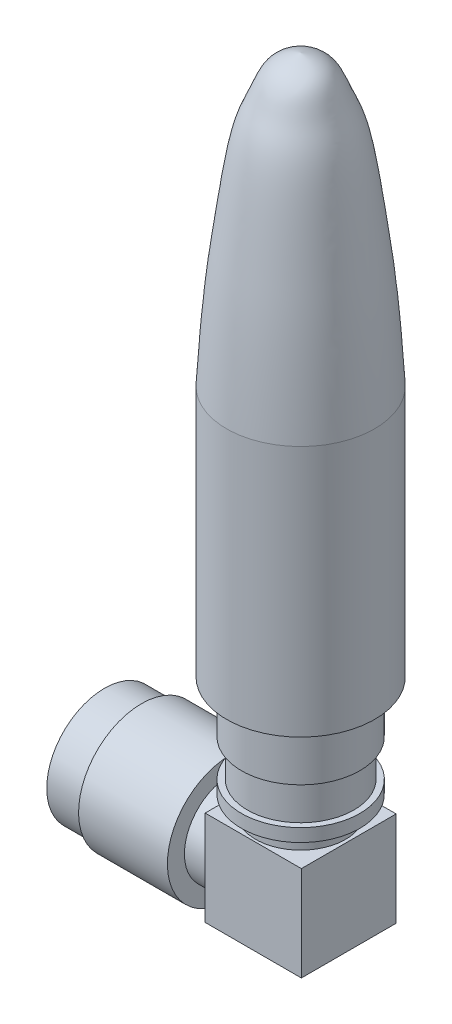
ISO-10303-21;
HEADER;
FILE_DESCRIPTION(('STEP AP214'),'2;1');
FILE_NAME('part.step','',(''),(''),'','','');
FILE_SCHEMA(('AUTOMOTIVE_DESIGN { 1 0 10303 214 1 1 1 1 }'));
ENDSEC;
DATA;
#1=APPLICATION_CONTEXT('core data for automotive mechanical design processes');
#2=APPLICATION_PROTOCOL_DEFINITION('international standard','automotive_design',2000,#1);
#3=PRODUCT_CONTEXT('',#1,'mechanical');
#4=PRODUCT('Part','Part','',(#3));
#5=PRODUCT_RELATED_PRODUCT_CATEGORY('part','',(#4));
#6=PRODUCT_DEFINITION_FORMATION('','',#4);
#7=PRODUCT_DEFINITION_CONTEXT('part definition',#1,'design');
#8=PRODUCT_DEFINITION('design','',#6,#7);
#9=PRODUCT_DEFINITION_SHAPE('','',#8);
#10=(LENGTH_UNIT() NAMED_UNIT(*) SI_UNIT(.MILLI.,.METRE.));
#11=(NAMED_UNIT(*) PLANE_ANGLE_UNIT() SI_UNIT($,.RADIAN.));
#12=(NAMED_UNIT(*) SI_UNIT($,.STERADIAN.) SOLID_ANGLE_UNIT());
#13=UNCERTAINTY_MEASURE_WITH_UNIT(LENGTH_MEASURE(1.E-05),#10,'distance_accuracy_value','');
#14=(GEOMETRIC_REPRESENTATION_CONTEXT(3) GLOBAL_UNCERTAINTY_ASSIGNED_CONTEXT((#13)) GLOBAL_UNIT_ASSIGNED_CONTEXT((#10,
#11,#12)) REPRESENTATION_CONTEXT('',''));
#15=CARTESIAN_POINT('',(0.,0.,0.));
#16=DIRECTION('',(0.,0.,1.));
#17=DIRECTION('',(1.,0.,0.));
#18=AXIS2_PLACEMENT_3D('',#15,#16,#17);
#19=CARTESIAN_POINT('',(0.,44.5,0.));
#20=CARTESIAN_POINT('',(-1.89606189247461,44.0308086483441,0.));
#21=CARTESIAN_POINT('',(-1.97701979249376,43.1402962804108,0.));
#22=CARTESIAN_POINT('',(-3.37077611296164,40.0754867193968,0.));
#23=CARTESIAN_POINT('',(-3.77478050947354,37.4069595656387,0.));
#24=CARTESIAN_POINT('',(-4.72216637205014,30.033496438992,0.));
#25=CARTESIAN_POINT('',(-5.,25.,0.));
#26=B_SPLINE_CURVE_WITH_KNOTS('',3,(#19,#20,#21,#22,#23,#24,#25),.UNSPECIFIED.,.F.,.F.,(4,1,1,1,
4),(0.,0.430511616125023,0.521637502180353,0.867967598511861,1.),.UNSPECIFIED.);
#27=CARTESIAN_POINT('',(0.,-22.6950680606462,0.));
#28=DIRECTION('',(0.,-1.,0.));
#29=AXIS1_PLACEMENT('',#27,#28);
#30=SURFACE_OF_REVOLUTION('',#26,#29);
#31=CARTESIAN_POINT('',(0.,25.,0.));
#32=DIRECTION('',(0.,-1.,0.));
#33=DIRECTION('',(0.,0.,-1.));
#34=AXIS2_PLACEMENT_3D('',#31,#32,#33);
#35=CIRCLE('',#34,5.);
#36=CARTESIAN_POINT('',(0.,25.,-5.));
#37=VERTEX_POINT('',#36);
#38=EDGE_CURVE('E11',#37,#37,#35,.T.);
#39=ORIENTED_EDGE('',*,*,#38,.F.);
#40=EDGE_LOOP('',(#39));
#41=FACE_BOUND('',#40,.T.);
#42=CARTESIAN_POINT('',(0.,44.5,0.));
#43=VERTEX_POINT('',#42);
#44=VERTEX_LOOP('',#43);
#45=FACE_BOUND('',#44,.T.);
#46=ADVANCED_FACE('F34',(#41,#45),#30,.T.);
#47=CARTESIAN_POINT('',(0.,-22.6950680606462,0.));
#48=DIRECTION('',(0.,-1.,0.));
#49=DIRECTION('',(0.,0.,-1.));
#50=AXIS2_PLACEMENT_3D('',#47,#48,#49);
#51=CYLINDRICAL_SURFACE('',#50,5.);
#52=CARTESIAN_POINT('',(0.,8.,0.));
#53=DIRECTION('',(0.,-1.,0.));
#54=DIRECTION('',(0.,0.,-1.));
#55=AXIS2_PLACEMENT_3D('',#52,#53,#54);
#56=CIRCLE('',#55,5.);
#57=CARTESIAN_POINT('',(0.,8.,-5.));
#58=VERTEX_POINT('',#57);
#59=EDGE_CURVE('E42',#58,#58,#56,.T.);
#60=ORIENTED_EDGE('',*,*,#59,.F.);
#61=EDGE_LOOP('',(#60));
#62=FACE_BOUND('',#61,.T.);
#63=ORIENTED_EDGE('',*,*,#38,.T.);
#64=EDGE_LOOP('',(#63));
#65=FACE_BOUND('',#64,.T.);
#66=ADVANCED_FACE('F150',(#62,#65),#51,.T.);
#67=CARTESIAN_POINT('',(-4.,8.,0.));
#68=DIRECTION('',(0.,1.,0.));
#69=DIRECTION('',(0.,0.,1.));
#70=AXIS2_PLACEMENT_3D('',#67,#68,#69);
#71=PLANE('',#70);
#72=CARTESIAN_POINT('',(0.,8.,0.));
#73=DIRECTION('',(0.,-1.,0.));
#74=DIRECTION('',(0.,0.,-1.));
#75=AXIS2_PLACEMENT_3D('',#72,#73,#74);
#76=CIRCLE('',#75,4.);
#77=CARTESIAN_POINT('',(0.,8.,-4.));
#78=VERTEX_POINT('',#77);
#79=EDGE_CURVE('E143',#78,#78,#76,.T.);
#80=ORIENTED_EDGE('',*,*,#79,.F.);
#81=EDGE_LOOP('',(#80));
#82=FACE_BOUND('',#81,.T.);
#83=ORIENTED_EDGE('',*,*,#59,.T.);
#84=EDGE_LOOP('',(#83));
#85=FACE_BOUND('',#84,.T.);
#86=ADVANCED_FACE('F148',(#82,#85),#71,.F.);
#87=CARTESIAN_POINT('',(0.,-22.6950680606462,0.));
#88=DIRECTION('',(0.,-1.,0.));
#89=DIRECTION('',(0.,0.,-1.));
#90=AXIS2_PLACEMENT_3D('',#87,#88,#89);
#91=CYLINDRICAL_SURFACE('',#90,4.);
#92=CARTESIAN_POINT('',(0.,4.5,0.));
#93=DIRECTION('',(0.,-1.,0.));
#94=DIRECTION('',(0.,0.,-1.));
#95=AXIS2_PLACEMENT_3D('',#92,#93,#94);
#96=CIRCLE('',#95,4.);
#97=CARTESIAN_POINT('',(0.,4.5,-4.));
#98=VERTEX_POINT('',#97);
#99=EDGE_CURVE('E140',#98,#98,#96,.T.);
#100=ORIENTED_EDGE('',*,*,#99,.F.);
#101=EDGE_LOOP('',(#100));
#102=FACE_BOUND('',#101,.T.);
#103=ORIENTED_EDGE('',*,*,#79,.T.);
#104=EDGE_LOOP('',(#103));
#105=FACE_BOUND('',#104,.T.);
#106=ADVANCED_FACE('F168',(#102,#105),#91,.T.);
#107=CARTESIAN_POINT('',(-3.6,4.5,0.));
#108=DIRECTION('',(0.,1.,0.));
#109=DIRECTION('',(0.,0.,1.));
#110=AXIS2_PLACEMENT_3D('',#107,#108,#109);
#111=PLANE('',#110);
#112=CARTESIAN_POINT('',(0.,4.5,0.));
#113=DIRECTION('',(0.,-1.,0.));
#114=DIRECTION('',(0.,0.,-1.));
#115=AXIS2_PLACEMENT_3D('',#112,#113,#114);
#116=CIRCLE('',#115,3.6);
#117=CARTESIAN_POINT('',(0.,4.5,-3.6));
#118=VERTEX_POINT('',#117);
#119=EDGE_CURVE('E137',#118,#118,#116,.T.);
#120=ORIENTED_EDGE('',*,*,#119,.F.);
#121=EDGE_LOOP('',(#120));
#122=FACE_BOUND('',#121,.T.);
#123=ORIENTED_EDGE('',*,*,#99,.T.);
#124=EDGE_LOOP('',(#123));
#125=FACE_BOUND('',#124,.T.);
#126=ADVANCED_FACE('F176',(#122,#125),#111,.F.);
#127=CARTESIAN_POINT('',(0.,-22.6950680606462,0.));
#128=DIRECTION('',(0.,-1.,0.));
#129=DIRECTION('',(0.,0.,-1.));
#130=AXIS2_PLACEMENT_3D('',#127,#128,#129);
#131=CYLINDRICAL_SURFACE('',#130,3.6);
#132=CARTESIAN_POINT('',(0.,2.,0.));
#133=DIRECTION('',(0.,-1.,0.));
#134=DIRECTION('',(0.,0.,-1.));
#135=AXIS2_PLACEMENT_3D('',#132,#133,#134);
#136=CIRCLE('',#135,3.6);
#137=CARTESIAN_POINT('',(0.,2.,-3.6));
#138=VERTEX_POINT('',#137);
#139=EDGE_CURVE('E134',#138,#138,#136,.T.);
#140=ORIENTED_EDGE('',*,*,#139,.F.);
#141=EDGE_LOOP('',(#140));
#142=FACE_BOUND('',#141,.T.);
#143=ORIENTED_EDGE('',*,*,#119,.T.);
#144=EDGE_LOOP('',(#143));
#145=FACE_BOUND('',#144,.T.);
#146=ADVANCED_FACE('F184',(#142,#145),#131,.T.);
#147=CARTESIAN_POINT('',(-4.,2.,0.));
#148=DIRECTION('',(0.,-1.,0.));
#149=DIRECTION('',(0.,0.,-1.));
#150=AXIS2_PLACEMENT_3D('',#147,#148,#149);
#151=PLANE('',#150);
#152=CARTESIAN_POINT('',(0.,2.,0.));
#153=DIRECTION('',(0.,-1.,0.));
#154=DIRECTION('',(0.,0.,-1.));
#155=AXIS2_PLACEMENT_3D('',#152,#153,#154);
#156=CIRCLE('',#155,4.);
#157=CARTESIAN_POINT('',(0.,2.,-4.));
#158=VERTEX_POINT('',#157);
#159=EDGE_CURVE('E131',#158,#158,#156,.T.);
#160=ORIENTED_EDGE('',*,*,#159,.F.);
#161=EDGE_LOOP('',(#160));
#162=FACE_BOUND('',#161,.T.);
#163=ORIENTED_EDGE('',*,*,#139,.T.);
#164=EDGE_LOOP('',(#163));
#165=FACE_BOUND('',#164,.T.);
#166=ADVANCED_FACE('F192',(#162,#165),#151,.F.);
#167=CARTESIAN_POINT('',(0.,-22.6950680606462,0.));
#168=DIRECTION('',(0.,-1.,0.));
#169=DIRECTION('',(0.,0.,-1.));
#170=AXIS2_PLACEMENT_3D('',#167,#168,#169);
#171=CYLINDRICAL_SURFACE('',#170,4.);
#172=CARTESIAN_POINT('',(0.,1.12572041639324,0.));
#173=DIRECTION('',(0.,-1.,0.));
#174=DIRECTION('',(0.,0.,-1.));
#175=AXIS2_PLACEMENT_3D('',#172,#173,#174);
#176=CIRCLE('',#175,4.);
#177=CARTESIAN_POINT('',(0.,1.12572041639324,-4.));
#178=VERTEX_POINT('',#177);
#179=EDGE_CURVE('E128',#178,#178,#176,.T.);
#180=ORIENTED_EDGE('',*,*,#179,.F.);
#181=EDGE_LOOP('',(#180));
#182=FACE_BOUND('',#181,.T.);
#183=ORIENTED_EDGE('',*,*,#159,.T.);
#184=EDGE_LOOP('',(#183));
#185=FACE_BOUND('',#184,.T.);
#186=ADVANCED_FACE('F200',(#182,#185),#171,.T.);
#187=CARTESIAN_POINT('',(-3.03667061907664,1.12572041639323,0.));
#188=DIRECTION('',(0.,1.,0.));
#189=DIRECTION('',(0.,0.,1.));
#190=AXIS2_PLACEMENT_3D('',#187,#188,#189);
#191=PLANE('',#190);
#192=CARTESIAN_POINT('',(0.,1.12572041639324,0.));
#193=DIRECTION('',(0.,-1.,0.));
#194=DIRECTION('',(0.,0.,-1.));
#195=AXIS2_PLACEMENT_3D('',#192,#193,#194);
#196=CIRCLE('',#195,3.03667061907664);
#197=CARTESIAN_POINT('',(0.,1.12572041639324,-3.03667061907664));
#198=VERTEX_POINT('',#197);
#199=EDGE_CURVE('E125',#198,#198,#196,.T.);
#200=ORIENTED_EDGE('',*,*,#199,.F.);
#201=EDGE_LOOP('',(#200));
#202=FACE_BOUND('',#201,.T.);
#203=ORIENTED_EDGE('',*,*,#179,.T.);
#204=EDGE_LOOP('',(#203));
#205=FACE_BOUND('',#204,.T.);
#206=ADVANCED_FACE('F208',(#202,#205),#191,.F.);
#207=CARTESIAN_POINT('',(0.,-22.6950680606462,0.));
#208=DIRECTION('',(0.,-1.,0.));
#209=DIRECTION('',(0.,0.,-1.));
#210=AXIS2_PLACEMENT_3D('',#207,#208,#209);
#211=CYLINDRICAL_SURFACE('',#210,3.03667061907664);
#212=CARTESIAN_POINT('',(0.,0.,0.));
#213=DIRECTION('',(0.,-1.,0.));
#214=DIRECTION('',(0.,0.,-1.));
#215=AXIS2_PLACEMENT_3D('',#212,#213,#214);
#216=CIRCLE('',#215,3.03667061907664);
#217=CARTESIAN_POINT('',(0.,0.,-3.03667061907664));
#218=VERTEX_POINT('',#217);
#219=EDGE_CURVE('E115',#218,#218,#216,.T.);
#220=ORIENTED_EDGE('',*,*,#219,.F.);
#221=EDGE_LOOP('',(#220));
#222=FACE_BOUND('',#221,.T.);
#223=ORIENTED_EDGE('',*,*,#199,.T.);
#224=EDGE_LOOP('',(#223));
#225=FACE_BOUND('',#224,.T.);
#226=ADVANCED_FACE('F216',(#222,#225),#211,.T.);
#227=CARTESIAN_POINT('',(0.,0.,0.));
#228=DIRECTION('',(0.,-1.,0.));
#229=DIRECTION('',(0.,0.,-1.));
#230=AXIS2_PLACEMENT_3D('',#227,#228,#229);
#231=PLANE('',#230);
#232=DIRECTION('',(0.,0.,-1.));
#233=VECTOR('',#232,1.);
#234=CARTESIAN_POINT('',(-3.25,0.,3.2));
#235=LINE('',#234,#233);
#236=CARTESIAN_POINT('',(-3.25,0.,3.2));
#237=VERTEX_POINT('',#236);
#238=CARTESIAN_POINT('',(-3.25,0.,-3.2));
#239=VERTEX_POINT('',#238);
#240=EDGE_CURVE('E105',#237,#239,#235,.T.);
#241=ORIENTED_EDGE('',*,*,#240,.F.);
#242=DIRECTION('',(-1.,0.,0.));
#243=VECTOR('',#242,1.);
#244=CARTESIAN_POINT('',(-3.25,0.,3.2));
#245=LINE('',#244,#243);
#246=CARTESIAN_POINT('',(3.25,0.,3.2));
#247=VERTEX_POINT('',#246);
#248=EDGE_CURVE('E73',#247,#237,#245,.T.);
#249=ORIENTED_EDGE('',*,*,#248,.F.);
#250=DIRECTION('',(0.,0.,1.));
#251=VECTOR('',#250,1.);
#252=CARTESIAN_POINT('',(3.25,0.,3.2));
#253=LINE('',#252,#251);
#254=CARTESIAN_POINT('',(3.25,0.,-3.2));
#255=VERTEX_POINT('',#254);
#256=EDGE_CURVE('E110',#255,#247,#253,.T.);
#257=ORIENTED_EDGE('',*,*,#256,.F.);
#258=DIRECTION('',(1.,0.,0.));
#259=VECTOR('',#258,1.);
#260=CARTESIAN_POINT('',(-3.25,0.,-3.2));
#261=LINE('',#260,#259);
#262=EDGE_CURVE('E93',#239,#255,#261,.T.);
#263=ORIENTED_EDGE('',*,*,#262,.F.);
#264=EDGE_LOOP('',(#241,#249,#257,#263));
#265=FACE_BOUND('',#264,.T.);
#266=ORIENTED_EDGE('',*,*,#219,.T.);
#267=EDGE_LOOP('',(#266));
#268=FACE_BOUND('',#267,.T.);
#269=ADVANCED_FACE('F224',(#265,#268),#231,.F.);
#270=CARTESIAN_POINT('',(-3.25,-6.4,3.2));
#271=DIRECTION('',(1.,0.,0.));
#272=DIRECTION('',(0.,0.,-1.));
#273=AXIS2_PLACEMENT_3D('',#270,#271,#272);
#274=PLANE('',#273);
#275=CARTESIAN_POINT('',(-3.25,-3.2,0.));
#276=DIRECTION('',(1.,0.,0.));
#277=DIRECTION('',(0.,1.,0.));
#278=AXIS2_PLACEMENT_3D('',#275,#276,#277);
#279=CIRCLE('',#278,3.1);
#280=CARTESIAN_POINT('',(-3.25,-0.100000000000001,0.));
#281=VERTEX_POINT('',#280);
#282=EDGE_CURVE('E108',#281,#281,#279,.T.);
#283=ORIENTED_EDGE('',*,*,#282,.T.);
#284=EDGE_LOOP('',(#283));
#285=FACE_BOUND('',#284,.T.);
#286=ORIENTED_EDGE('',*,*,#240,.T.);
#287=DIRECTION('',(0.,1.,0.));
#288=VECTOR('',#287,1.);
#289=CARTESIAN_POINT('',(-3.25,-6.4,-3.2));
#290=LINE('',#289,#288);
#291=CARTESIAN_POINT('',(-3.25,-6.4,-3.2));
#292=VERTEX_POINT('',#291);
#293=EDGE_CURVE('E96',#292,#239,#290,.T.);
#294=ORIENTED_EDGE('',*,*,#293,.F.);
#295=DIRECTION('',(0.,0.,-1.));
#296=VECTOR('',#295,1.);
#297=CARTESIAN_POINT('',(-3.25,-6.4,3.2));
#298=LINE('',#297,#296);
#299=CARTESIAN_POINT('',(-3.25,-6.4,3.2));
#300=VERTEX_POINT('',#299);
#301=EDGE_CURVE('E87',#300,#292,#298,.T.);
#302=ORIENTED_EDGE('',*,*,#301,.F.);
#303=DIRECTION('',(0.,1.,0.));
#304=VECTOR('',#303,1.);
#305=CARTESIAN_POINT('',(-3.25,-6.4,3.2));
#306=LINE('',#305,#304);
#307=EDGE_CURVE('E101',#300,#237,#306,.T.);
#308=ORIENTED_EDGE('',*,*,#307,.T.);
#309=EDGE_LOOP('',(#286,#294,#302,#308));
#310=FACE_BOUND('',#309,.T.);
#311=ADVANCED_FACE('F232',(#285,#310),#274,.F.);
#312=CARTESIAN_POINT('',(-3.25,-6.4,-3.2));
#313=DIRECTION('',(0.,0.,1.));
#314=DIRECTION('',(1.,0.,0.));
#315=AXIS2_PLACEMENT_3D('',#312,#313,#314);
#316=PLANE('',#315);
#317=ORIENTED_EDGE('',*,*,#262,.T.);
#318=DIRECTION('',(0.,1.,0.));
#319=VECTOR('',#318,1.);
#320=CARTESIAN_POINT('',(3.25,-6.4,-3.2));
#321=LINE('',#320,#319);
#322=CARTESIAN_POINT('',(3.25,-6.4,-3.2));
#323=VERTEX_POINT('',#322);
#324=EDGE_CURVE('E91',#323,#255,#321,.T.);
#325=ORIENTED_EDGE('',*,*,#324,.F.);
#326=DIRECTION('',(1.,0.,0.));
#327=VECTOR('',#326,1.);
#328=CARTESIAN_POINT('',(-3.25,-6.4,-3.2));
#329=LINE('',#328,#327);
#330=EDGE_CURVE('E81',#292,#323,#329,.T.);
#331=ORIENTED_EDGE('',*,*,#330,.F.);
#332=ORIENTED_EDGE('',*,*,#293,.T.);
#333=EDGE_LOOP('',(#317,#325,#331,#332));
#334=FACE_BOUND('',#333,.T.);
#335=ADVANCED_FACE('F92',(#334),#316,.F.);
#336=CARTESIAN_POINT('',(3.25,-6.4,3.2));
#337=DIRECTION('',(-1.,0.,0.));
#338=DIRECTION('',(0.,0.,1.));
#339=AXIS2_PLACEMENT_3D('',#336,#337,#338);
#340=PLANE('',#339);
#341=ORIENTED_EDGE('',*,*,#256,.T.);
#342=DIRECTION('',(0.,1.,0.));
#343=VECTOR('',#342,1.);
#344=CARTESIAN_POINT('',(3.25,-6.4,3.2));
#345=LINE('',#344,#343);
#346=CARTESIAN_POINT('',(3.25,-6.4,3.2));
#347=VERTEX_POINT('',#346);
#348=EDGE_CURVE('E97',#347,#247,#345,.T.);
#349=ORIENTED_EDGE('',*,*,#348,.F.);
#350=DIRECTION('',(0.,0.,1.));
#351=VECTOR('',#350,1.);
#352=CARTESIAN_POINT('',(3.25,-6.4,3.2));
#353=LINE('',#352,#351);
#354=EDGE_CURVE('E84',#323,#347,#353,.T.);
#355=ORIENTED_EDGE('',*,*,#354,.F.);
#356=ORIENTED_EDGE('',*,*,#324,.T.);
#357=EDGE_LOOP('',(#341,#349,#355,#356));
#358=FACE_BOUND('',#357,.T.);
#359=ADVANCED_FACE('F99',(#358),#340,.F.);
#360=CARTESIAN_POINT('',(-3.25,-6.4,3.2));
#361=DIRECTION('',(0.,0.,-1.));
#362=DIRECTION('',(-1.,0.,0.));
#363=AXIS2_PLACEMENT_3D('',#360,#361,#362);
#364=PLANE('',#363);
#365=ORIENTED_EDGE('',*,*,#248,.T.);
#366=ORIENTED_EDGE('',*,*,#307,.F.);
#367=DIRECTION('',(-1.,0.,0.));
#368=VECTOR('',#367,1.);
#369=CARTESIAN_POINT('',(-3.25,-6.4,3.2));
#370=LINE('',#369,#368);
#371=EDGE_CURVE('E53',#347,#300,#370,.T.);
#372=ORIENTED_EDGE('',*,*,#371,.F.);
#373=ORIENTED_EDGE('',*,*,#348,.T.);
#374=EDGE_LOOP('',(#365,#366,#372,#373));
#375=FACE_BOUND('',#374,.T.);
#376=ADVANCED_FACE('F255',(#375),#364,.F.);
#377=CARTESIAN_POINT('',(0.,-6.4,0.));
#378=DIRECTION('',(0.,-1.,0.));
#379=DIRECTION('',(0.,0.,-1.));
#380=AXIS2_PLACEMENT_3D('',#377,#378,#379);
#381=PLANE('',#380);
#382=ORIENTED_EDGE('',*,*,#301,.T.);
#383=ORIENTED_EDGE('',*,*,#330,.T.);
#384=ORIENTED_EDGE('',*,*,#354,.T.);
#385=ORIENTED_EDGE('',*,*,#371,.T.);
#386=EDGE_LOOP('',(#382,#383,#384,#385));
#387=FACE_BOUND('',#386,.T.);
#388=ADVANCED_FACE('F82',(#387),#381,.T.);
#389=CARTESIAN_POINT('',(-3.25,-3.2,0.));
#390=DIRECTION('',(1.,0.,0.));
#391=DIRECTION('',(0.,1.,0.));
#392=AXIS2_PLACEMENT_3D('',#389,#390,#391);
#393=CYLINDRICAL_SURFACE('',#392,3.1);
#394=CARTESIAN_POINT('',(-4.75,-3.2,0.));
#395=DIRECTION('',(1.,0.,0.));
#396=DIRECTION('',(0.,1.,0.));
#397=AXIS2_PLACEMENT_3D('',#394,#395,#396);
#398=CIRCLE('',#397,3.1);
#399=CARTESIAN_POINT('',(-4.75,-0.100000000000001,0.));
#400=VERTEX_POINT('',#399);
#401=EDGE_CURVE('E400',#400,#400,#398,.T.);
#402=ORIENTED_EDGE('',*,*,#401,.T.);
#403=EDGE_LOOP('',(#402));
#404=FACE_BOUND('',#403,.T.);
#405=ORIENTED_EDGE('',*,*,#282,.F.);
#406=EDGE_LOOP('',(#405));
#407=FACE_BOUND('',#406,.T.);
#408=ADVANCED_FACE('F267',(#404,#407),#393,.T.);
#409=CARTESIAN_POINT('',(-4.75,-0.100000000000001,0.));
#410=DIRECTION('',(1.,0.,0.));
#411=DIRECTION('',(0.,1.,0.));
#412=AXIS2_PLACEMENT_3D('',#409,#410,#411);
#413=PLANE('',#412);
#414=CARTESIAN_POINT('',(-4.75,-3.2,0.));
#415=DIRECTION('',(1.,0.,0.));
#416=DIRECTION('',(0.,1.,0.));
#417=AXIS2_PLACEMENT_3D('',#414,#415,#416);
#418=CIRCLE('',#417,4.25);
#419=CARTESIAN_POINT('',(-4.75,1.05,0.));
#420=VERTEX_POINT('',#419);
#421=EDGE_CURVE('E397',#420,#420,#418,.T.);
#422=ORIENTED_EDGE('',*,*,#421,.T.);
#423=EDGE_LOOP('',(#422));
#424=FACE_BOUND('',#423,.T.);
#425=ORIENTED_EDGE('',*,*,#401,.F.);
#426=EDGE_LOOP('',(#425));
#427=FACE_BOUND('',#426,.T.);
#428=ADVANCED_FACE('F273',(#424,#427),#413,.T.);
#429=CARTESIAN_POINT('',(-3.25,-3.2,0.));
#430=DIRECTION('',(1.,0.,0.));
#431=DIRECTION('',(0.,1.,0.));
#432=AXIS2_PLACEMENT_3D('',#429,#430,#431);
#433=CYLINDRICAL_SURFACE('',#432,4.25);
#434=CARTESIAN_POINT('',(-10.75,-3.2,0.));
#435=DIRECTION('',(1.,0.,0.));
#436=DIRECTION('',(0.,1.,0.));
#437=AXIS2_PLACEMENT_3D('',#434,#435,#436);
#438=CIRCLE('',#437,4.25);
#439=CARTESIAN_POINT('',(-10.75,1.05,0.));
#440=VERTEX_POINT('',#439);
#441=EDGE_CURVE('E394',#440,#440,#438,.T.);
#442=ORIENTED_EDGE('',*,*,#441,.T.);
#443=EDGE_LOOP('',(#442));
#444=FACE_BOUND('',#443,.T.);
#445=ORIENTED_EDGE('',*,*,#421,.F.);
#446=EDGE_LOOP('',(#445));
#447=FACE_BOUND('',#446,.T.);
#448=ADVANCED_FACE('F281',(#444,#447),#433,.T.);
#449=CARTESIAN_POINT('',(-10.75,1.05,0.));
#450=DIRECTION('',(-1.,0.,0.));
#451=DIRECTION('',(0.,-1.,0.));
#452=AXIS2_PLACEMENT_3D('',#449,#450,#451);
#453=PLANE('',#452);
#454=CARTESIAN_POINT('',(-10.75,-3.2,0.));
#455=DIRECTION('',(1.,0.,0.));
#456=DIRECTION('',(0.,1.,0.));
#457=AXIS2_PLACEMENT_3D('',#454,#455,#456);
#458=CIRCLE('',#457,3.9);
#459=CARTESIAN_POINT('',(-10.75,0.699999999999998,0.));
#460=VERTEX_POINT('',#459);
#461=EDGE_CURVE('E387',#460,#460,#458,.T.);
#462=ORIENTED_EDGE('',*,*,#461,.T.);
#463=EDGE_LOOP('',(#462));
#464=FACE_BOUND('',#463,.T.);
#465=ORIENTED_EDGE('',*,*,#441,.F.);
#466=EDGE_LOOP('',(#465));
#467=FACE_BOUND('',#466,.T.);
#468=ADVANCED_FACE('F289',(#464,#467),#453,.T.);
#469=CARTESIAN_POINT('',(-3.25,-3.2,0.));
#470=DIRECTION('',(1.,0.,0.));
#471=DIRECTION('',(0.,1.,0.));
#472=AXIS2_PLACEMENT_3D('',#469,#470,#471);
#473=CYLINDRICAL_SURFACE('',#472,3.9);
#474=CARTESIAN_POINT('',(-13.25,-3.2,0.));
#475=DIRECTION('',(1.,0.,0.));
#476=DIRECTION('',(0.,1.,0.));
#477=AXIS2_PLACEMENT_3D('',#474,#475,#476);
#478=CIRCLE('',#477,3.9);
#479=CARTESIAN_POINT('',(-13.25,0.699999999999998,0.));
#480=VERTEX_POINT('',#479);
#481=EDGE_CURVE('E383',#480,#480,#478,.T.);
#482=ORIENTED_EDGE('',*,*,#481,.T.);
#483=EDGE_LOOP('',(#482));
#484=FACE_BOUND('',#483,.T.);
#485=ORIENTED_EDGE('',*,*,#461,.F.);
#486=EDGE_LOOP('',(#485));
#487=FACE_BOUND('',#486,.T.);
#488=ADVANCED_FACE('F297',(#484,#487),#473,.T.);
#489=CARTESIAN_POINT('',(-13.25,0.699999999999998,0.));
#490=DIRECTION('',(-1.,0.,0.));
#491=DIRECTION('',(0.,-1.,0.));
#492=AXIS2_PLACEMENT_3D('',#489,#490,#491);
#493=PLANE('',#492);
#494=CARTESIAN_POINT('',(-13.25,-3.2,0.));
#495=DIRECTION('',(-1.,0.,0.));
#496=DIRECTION('',(0.,-1.,0.));
#497=AXIS2_PLACEMENT_3D('',#494,#495,#496);
#498=CIRCLE('',#497,2.7);
#499=CARTESIAN_POINT('',(-13.25,-5.9,0.));
#500=VERTEX_POINT('',#499);
#501=EDGE_CURVE('E384',#500,#500,#498,.T.);
#502=ORIENTED_EDGE('',*,*,#501,.F.);
#503=EDGE_LOOP('',(#502));
#504=FACE_BOUND('',#503,.T.);
#505=ORIENTED_EDGE('',*,*,#481,.F.);
#506=EDGE_LOOP('',(#505));
#507=FACE_BOUND('',#506,.T.);
#508=ADVANCED_FACE('F305',(#504,#507),#493,.T.);
#509=CARTESIAN_POINT('',(-8.25,-3.2,0.));
#510=DIRECTION('',(-1.,0.,0.));
#511=DIRECTION('',(0.,-1.,0.));
#512=AXIS2_PLACEMENT_3D('',#509,#510,#511);
#513=CYLINDRICAL_SURFACE('',#512,2.7);
#514=CARTESIAN_POINT('',(-8.25,-3.2,0.));
#515=DIRECTION('',(-1.,0.,0.));
#516=DIRECTION('',(0.,-1.,0.));
#517=AXIS2_PLACEMENT_3D('',#514,#515,#516);
#518=CIRCLE('',#517,2.7);
#519=CARTESIAN_POINT('',(-8.25,-5.9,0.));
#520=VERTEX_POINT('',#519);
#521=EDGE_CURVE('E382',#520,#520,#518,.T.);
#522=ORIENTED_EDGE('',*,*,#521,.F.);
#523=EDGE_LOOP('',(#522));
#524=FACE_BOUND('',#523,.T.);
#525=ORIENTED_EDGE('',*,*,#501,.T.);
#526=EDGE_LOOP('',(#525));
#527=FACE_BOUND('',#526,.T.);
#528=ADVANCED_FACE('F313',(#524,#527),#513,.F.);
#529=CARTESIAN_POINT('',(-8.25,-3.2,0.));
#530=DIRECTION('',(-1.,0.,0.));
#531=DIRECTION('',(0.,-1.,0.));
#532=AXIS2_PLACEMENT_3D('',#529,#530,#531);
#533=PLANE('',#532);
#534=ORIENTED_EDGE('',*,*,#521,.T.);
#535=EDGE_LOOP('',(#534));
#536=FACE_BOUND('',#535,.T.);
#537=ADVANCED_FACE('F321',(#536),#533,.T.);
#538=CLOSED_SHELL('',(#46,#66,#86,#106,#126,#146,#166,#186,#206,#226,#269,#311,#335,#359,#376,
#388,#408,#428,#448,#468,#488,#508,#528,#537));
#539=MANIFOLD_SOLID_BREP('B2',#538);
#540=ADVANCED_BREP_SHAPE_REPRESENTATION('',(#18,#539),#14);
#541=SHAPE_DEFINITION_REPRESENTATION(#9,#540);
ENDSEC;
END-ISO-10303-21;
